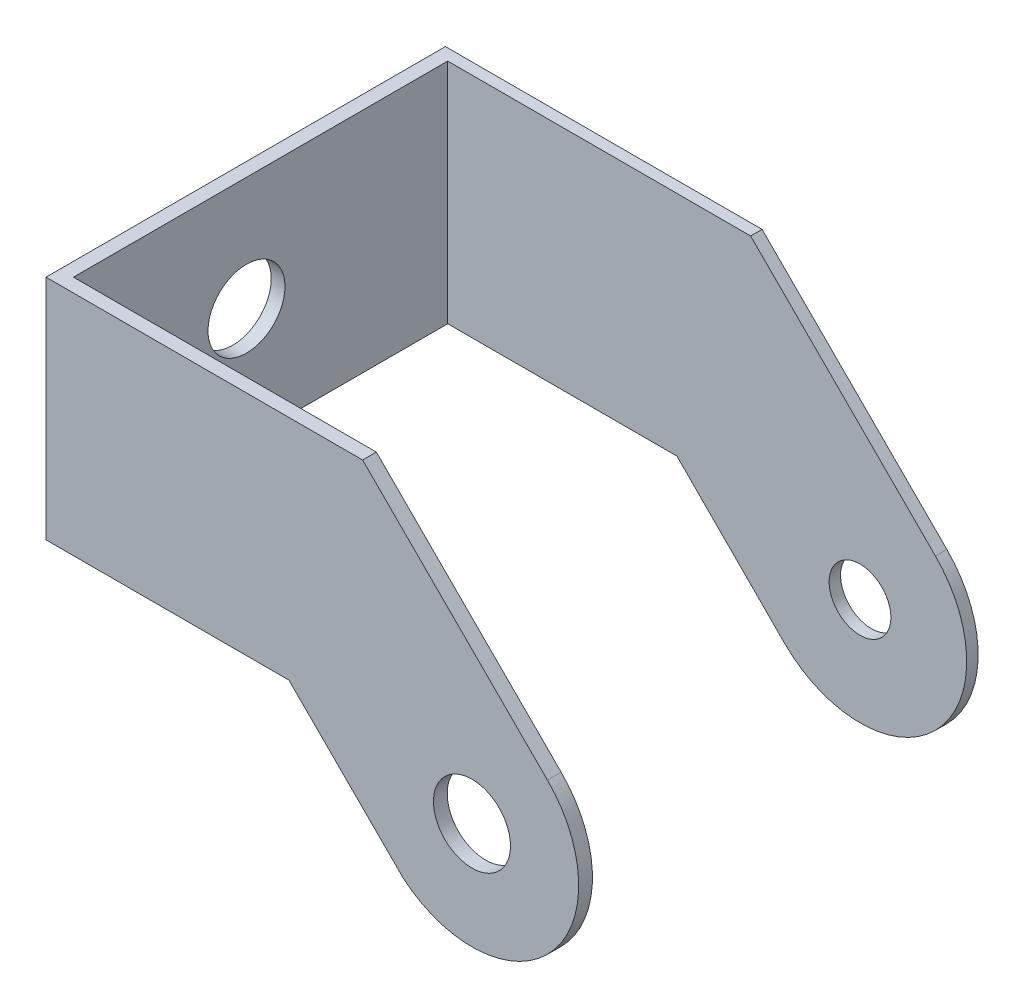
ISO-10303-21;
HEADER;
FILE_DESCRIPTION(('STEP AP214'),'2;1');
FILE_NAME('part.step','',(''),(''),'','','');
FILE_SCHEMA(('AUTOMOTIVE_DESIGN { 1 0 10303 214 1 1 1 1 }'));
ENDSEC;
DATA;
#1=APPLICATION_CONTEXT('core data for automotive mechanical design processes');
#2=APPLICATION_PROTOCOL_DEFINITION('international standard','automotive_design',2000,#1);
#3=PRODUCT_CONTEXT('',#1,'mechanical');
#4=PRODUCT('Part','Part','',(#3));
#5=PRODUCT_RELATED_PRODUCT_CATEGORY('part','',(#4));
#6=PRODUCT_DEFINITION_FORMATION('','',#4);
#7=PRODUCT_DEFINITION_CONTEXT('part definition',#1,'design');
#8=PRODUCT_DEFINITION('design','',#6,#7);
#9=PRODUCT_DEFINITION_SHAPE('','',#8);
#10=(LENGTH_UNIT() NAMED_UNIT(*) SI_UNIT(.MILLI.,.METRE.));
#11=(NAMED_UNIT(*) PLANE_ANGLE_UNIT() SI_UNIT($,.RADIAN.));
#12=(NAMED_UNIT(*) SI_UNIT($,.STERADIAN.) SOLID_ANGLE_UNIT());
#13=UNCERTAINTY_MEASURE_WITH_UNIT(LENGTH_MEASURE(1.E-05),#10,'distance_accuracy_value','');
#14=(GEOMETRIC_REPRESENTATION_CONTEXT(3) GLOBAL_UNCERTAINTY_ASSIGNED_CONTEXT((#13)) GLOBAL_UNIT_ASSIGNED_CONTEXT((#10,
#11,#12)) REPRESENTATION_CONTEXT('',''));
#15=CARTESIAN_POINT('',(0.,0.,0.));
#16=DIRECTION('',(0.,0.,1.));
#17=DIRECTION('',(1.,0.,0.));
#18=AXIS2_PLACEMENT_3D('',#15,#16,#17);
#19=CARTESIAN_POINT('',(0.,0.,0.));
#20=DIRECTION('',(0.,0.,1.));
#21=DIRECTION('',(1.,0.,0.));
#22=AXIS2_PLACEMENT_3D('',#19,#20,#21);
#23=PLANE('',#22);
#24=CARTESIAN_POINT('',(0.,0.,0.));
#25=DIRECTION('',(0.,0.,1.));
#26=DIRECTION('',(1.,0.,0.));
#27=AXIS2_PLACEMENT_3D('',#24,#25,#26);
#28=CIRCLE('',#27,5.05);
#29=CARTESIAN_POINT('',(5.05,0.,0.));
#30=VERTEX_POINT('',#29);
#31=EDGE_CURVE('E174',#30,#30,#28,.T.);
#32=ORIENTED_EDGE('',*,*,#31,.T.);
#33=EDGE_LOOP('',(#32));
#34=FACE_BOUND('',#33,.T.);
#35=DIRECTION('',(0.,-1.,0.));
#36=VECTOR('',#35,1.);
#37=CARTESIAN_POINT('',(-54.0823270036603,34.1445451971267,0.));
#38=LINE('',#37,#36);
#39=CARTESIAN_POINT('',(-54.0823270036603,34.1445451971267,0.));
#40=VERTEX_POINT('',#39);
#41=CARTESIAN_POINT('',(-54.0823270036603,4.30154748625039,0.));
#42=VERTEX_POINT('',#41);
#43=EDGE_CURVE('E52',#40,#42,#38,.T.);
#44=ORIENTED_EDGE('',*,*,#43,.F.);
#45=DIRECTION('',(-1.,0.,0.));
#46=VECTOR('',#45,1.);
#47=CARTESIAN_POINT('',(-55.8823270036603,34.1445451971267,0.));
#48=LINE('',#47,#46);
#49=CARTESIAN_POINT('',(-14.3455553239033,34.1445451971267,0.));
#50=VERTEX_POINT('',#49);
#51=EDGE_CURVE('E138',#50,#40,#48,.T.);
#52=ORIENTED_EDGE('',*,*,#51,.F.);
#53=DIRECTION('',(-0.707106781186547,0.707106781186548,0.));
#54=VECTOR('',#53,1.);
#55=CARTESIAN_POINT('',(9.89949493661166,9.89949493661166,0.));
#56=LINE('',#55,#54);
#57=CARTESIAN_POINT('',(9.89949493661166,9.89949493661166,0.));
#58=VERTEX_POINT('',#57);
#59=EDGE_CURVE('E135',#58,#50,#56,.T.);
#60=ORIENTED_EDGE('',*,*,#59,.F.);
#61=CARTESIAN_POINT('',(0.,0.,0.));
#62=DIRECTION('',(0.,0.,1.));
#63=DIRECTION('',(1.,0.,0.));
#64=AXIS2_PLACEMENT_3D('',#61,#62,#63);
#65=CIRCLE('',#64,14.);
#66=CARTESIAN_POINT('',(-8.97177070968306,-10.7474336626412,0.));
#67=VERTEX_POINT('',#66);
#68=EDGE_CURVE('E132',#67,#58,#65,.T.);
#69=ORIENTED_EDGE('',*,*,#68,.F.);
#70=DIRECTION('',(0.707106781186551,-0.707106781186544,0.));
#71=VECTOR('',#70,1.);
#72=CARTESIAN_POINT('',(-8.97177070968306,-10.7474336626412,0.));
#73=LINE('',#72,#71);
#74=CARTESIAN_POINT('',(-24.0207518585748,4.30154748625039,0.));
#75=VERTEX_POINT('',#74);
#76=EDGE_CURVE('E82',#75,#67,#73,.T.);
#77=ORIENTED_EDGE('',*,*,#76,.F.);
#78=DIRECTION('',(1.,0.,0.));
#79=VECTOR('',#78,1.);
#80=CARTESIAN_POINT('',(-24.0207518585748,4.30154748625039,0.));
#81=LINE('',#80,#79);
#82=EDGE_CURVE('E140',#42,#75,#81,.T.);
#83=ORIENTED_EDGE('',*,*,#82,.F.);
#84=EDGE_LOOP('',(#44,#52,#60,#69,#77,#83));
#85=FACE_BOUND('',#84,.T.);
#86=ADVANCED_FACE('F37',(#34,#85),#23,.F.);
#87=CARTESIAN_POINT('',(0.,0.,1.8));
#88=DIRECTION('',(0.,0.,1.));
#89=DIRECTION('',(1.,0.,0.));
#90=AXIS2_PLACEMENT_3D('',#87,#88,#89);
#91=PLANE('',#90);
#92=CARTESIAN_POINT('',(0.,0.,1.8));
#93=DIRECTION('',(0.,0.,1.));
#94=DIRECTION('',(1.,0.,0.));
#95=AXIS2_PLACEMENT_3D('',#92,#93,#94);
#96=CIRCLE('',#95,14.);
#97=CARTESIAN_POINT('',(-8.97177070968306,-10.7474336626412,1.8));
#98=VERTEX_POINT('',#97);
#99=CARTESIAN_POINT('',(9.89949493661166,9.89949493661166,1.8));
#100=VERTEX_POINT('',#99);
#101=EDGE_CURVE('E143',#98,#100,#96,.T.);
#102=ORIENTED_EDGE('',*,*,#101,.T.);
#103=DIRECTION('',(-0.707106781186547,0.707106781186548,0.));
#104=VECTOR('',#103,1.);
#105=CARTESIAN_POINT('',(9.89949493661166,9.89949493661166,1.8));
#106=LINE('',#105,#104);
#107=CARTESIAN_POINT('',(-14.3455553239033,34.1445451971267,1.8));
#108=VERTEX_POINT('',#107);
#109=EDGE_CURVE('E90',#100,#108,#106,.T.);
#110=ORIENTED_EDGE('',*,*,#109,.T.);
#111=DIRECTION('',(-1.,0.,0.));
#112=VECTOR('',#111,1.);
#113=CARTESIAN_POINT('',(-55.8823270036603,34.1445451971267,1.8));
#114=LINE('',#113,#112);
#115=CARTESIAN_POINT('',(-55.8823270036603,34.1445451971267,1.8));
#116=VERTEX_POINT('',#115);
#117=EDGE_CURVE('E107',#108,#116,#114,.T.);
#118=ORIENTED_EDGE('',*,*,#117,.T.);
#119=DIRECTION('',(0.,-1.,0.));
#120=VECTOR('',#119,1.);
#121=CARTESIAN_POINT('',(-55.8823270036603,4.30154748625039,1.8));
#122=LINE('',#121,#120);
#123=CARTESIAN_POINT('',(-55.8823270036603,4.30154748625039,1.8));
#124=VERTEX_POINT('',#123);
#125=EDGE_CURVE('E99',#116,#124,#122,.T.);
#126=ORIENTED_EDGE('',*,*,#125,.T.);
#127=DIRECTION('',(1.,0.,0.));
#128=VECTOR('',#127,1.);
#129=CARTESIAN_POINT('',(-24.0207518585748,4.30154748625039,1.8));
#130=LINE('',#129,#128);
#131=CARTESIAN_POINT('',(-24.0207518585748,4.30154748625039,1.8));
#132=VERTEX_POINT('',#131);
#133=EDGE_CURVE('E104',#124,#132,#130,.T.);
#134=ORIENTED_EDGE('',*,*,#133,.T.);
#135=DIRECTION('',(0.707106781186551,-0.707106781186544,0.));
#136=VECTOR('',#135,1.);
#137=CARTESIAN_POINT('',(-8.97177070968306,-10.7474336626412,1.8));
#138=LINE('',#137,#136);
#139=EDGE_CURVE('E61',#132,#98,#138,.T.);
#140=ORIENTED_EDGE('',*,*,#139,.T.);
#141=EDGE_LOOP('',(#102,#110,#118,#126,#134,#140));
#142=FACE_BOUND('',#141,.T.);
#143=CARTESIAN_POINT('',(0.,0.,1.8));
#144=DIRECTION('',(0.,0.,1.));
#145=DIRECTION('',(1.,0.,0.));
#146=AXIS2_PLACEMENT_3D('',#143,#144,#145);
#147=CIRCLE('',#146,5.05);
#148=CARTESIAN_POINT('',(5.05,0.,1.8));
#149=VERTEX_POINT('',#148);
#150=EDGE_CURVE('E136',#149,#149,#147,.T.);
#151=ORIENTED_EDGE('',*,*,#150,.F.);
#152=EDGE_LOOP('',(#151));
#153=FACE_BOUND('',#152,.T.);
#154=ADVANCED_FACE('F101',(#142,#153),#91,.T.);
#155=CARTESIAN_POINT('',(0.,0.,1.8));
#156=DIRECTION('',(0.,0.,-1.));
#157=DIRECTION('',(-1.,0.,0.));
#158=AXIS2_PLACEMENT_3D('',#155,#156,#157);
#159=CYLINDRICAL_SURFACE('',#158,14.);
#160=ORIENTED_EDGE('',*,*,#68,.T.);
#161=DIRECTION('',(0.,0.,-1.));
#162=VECTOR('',#161,1.);
#163=CARTESIAN_POINT('',(9.89949493661166,9.89949493661166,1.8));
#164=LINE('',#163,#162);
#165=EDGE_CURVE('E11',#100,#58,#164,.T.);
#166=ORIENTED_EDGE('',*,*,#165,.F.);
#167=ORIENTED_EDGE('',*,*,#101,.F.);
#168=DIRECTION('',(0.,0.,-1.));
#169=VECTOR('',#168,1.);
#170=CARTESIAN_POINT('',(-8.97177070968306,-10.7474336626412,1.8));
#171=LINE('',#170,#169);
#172=EDGE_CURVE('E128',#98,#67,#171,.T.);
#173=ORIENTED_EDGE('',*,*,#172,.T.);
#174=EDGE_LOOP('',(#160,#166,#167,#173));
#175=FACE_BOUND('',#174,.T.);
#176=ADVANCED_FACE('F39',(#175),#159,.T.);
#177=CARTESIAN_POINT('',(9.89949493661166,9.89949493661166,1.8));
#178=DIRECTION('',(-0.707106781186547,-0.707106781186547,0.));
#179=DIRECTION('',(0.707106781186547,-0.707106781186548,0.));
#180=AXIS2_PLACEMENT_3D('',#177,#178,#179);
#181=PLANE('',#180);
#182=ORIENTED_EDGE('',*,*,#59,.T.);
#183=DIRECTION('',(0.,0.,-1.));
#184=VECTOR('',#183,1.);
#185=CARTESIAN_POINT('',(-14.3455553239033,34.1445451971267,1.8));
#186=LINE('',#185,#184);
#187=EDGE_CURVE('E45',#108,#50,#186,.T.);
#188=ORIENTED_EDGE('',*,*,#187,.F.);
#189=ORIENTED_EDGE('',*,*,#109,.F.);
#190=ORIENTED_EDGE('',*,*,#165,.T.);
#191=EDGE_LOOP('',(#182,#188,#189,#190));
#192=FACE_BOUND('',#191,.T.);
#193=ADVANCED_FACE('F153',(#192),#181,.F.);
#194=CARTESIAN_POINT('',(-55.8823270036603,34.1445451971267,1.8));
#195=DIRECTION('',(0.,-1.,0.));
#196=DIRECTION('',(0.,0.,-1.));
#197=AXIS2_PLACEMENT_3D('',#194,#195,#196);
#198=PLANE('',#197);
#199=ORIENTED_EDGE('',*,*,#51,.T.);
#200=DIRECTION('',(0.,0.,1.));
#201=VECTOR('',#200,1.);
#202=CARTESIAN_POINT('',(-54.0823270036603,34.1445451971267,0.));
#203=LINE('',#202,#201);
#204=CARTESIAN_POINT('',(-54.0823270036603,34.1445451971267,-49.1));
#205=VERTEX_POINT('',#204);
#206=EDGE_CURVE('E166',#205,#40,#203,.T.);
#207=ORIENTED_EDGE('',*,*,#206,.F.);
#208=DIRECTION('',(1.,0.,0.));
#209=VECTOR('',#208,1.);
#210=CARTESIAN_POINT('',(-55.8823270036603,34.1445451971267,-49.1));
#211=LINE('',#210,#209);
#212=CARTESIAN_POINT('',(-14.3455553239033,34.1445451971267,-49.1));
#213=VERTEX_POINT('',#212);
#214=EDGE_CURVE('E388',#205,#213,#211,.T.);
#215=ORIENTED_EDGE('',*,*,#214,.T.);
#216=DIRECTION('',(0.,0.,1.));
#217=VECTOR('',#216,1.);
#218=CARTESIAN_POINT('',(-14.3455553239033,34.1445451971267,-50.6));
#219=LINE('',#218,#217);
#220=CARTESIAN_POINT('',(-14.3455553239033,34.1445451971267,-50.6));
#221=VERTEX_POINT('',#220);
#222=EDGE_CURVE('E395',#221,#213,#219,.T.);
#223=ORIENTED_EDGE('',*,*,#222,.F.);
#224=DIRECTION('',(1.,0.,0.));
#225=VECTOR('',#224,1.);
#226=CARTESIAN_POINT('',(-55.8823270036603,34.1445451971267,-50.6));
#227=LINE('',#226,#225);
#228=CARTESIAN_POINT('',(-55.8823270036603,34.1445451971267,-50.6));
#229=VERTEX_POINT('',#228);
#230=EDGE_CURVE('E375',#229,#221,#227,.T.);
#231=ORIENTED_EDGE('',*,*,#230,.F.);
#232=DIRECTION('',(0.,0.,-1.));
#233=VECTOR('',#232,1.);
#234=CARTESIAN_POINT('',(-55.8823270036603,34.1445451971267,1.8));
#235=LINE('',#234,#233);
#236=EDGE_CURVE('E123',#116,#229,#235,.T.);
#237=ORIENTED_EDGE('',*,*,#236,.F.);
#238=ORIENTED_EDGE('',*,*,#117,.F.);
#239=ORIENTED_EDGE('',*,*,#187,.T.);
#240=EDGE_LOOP('',(#199,#207,#215,#223,#231,#237,#238,#239));
#241=FACE_BOUND('',#240,.T.);
#242=ADVANCED_FACE('F148',(#241),#198,.F.);
#243=CARTESIAN_POINT('',(-55.8823270036603,4.30154748625039,1.8));
#244=DIRECTION('',(1.,0.,0.));
#245=DIRECTION('',(0.,0.,-1.));
#246=AXIS2_PLACEMENT_3D('',#243,#244,#245);
#247=PLANE('',#246);
#248=ORIENTED_EDGE('',*,*,#236,.T.);
#249=DIRECTION('',(0.,1.,0.));
#250=VECTOR('',#249,1.);
#251=CARTESIAN_POINT('',(-55.8823270036603,4.3015474862504,-50.6));
#252=LINE('',#251,#250);
#253=CARTESIAN_POINT('',(-55.8823270036603,4.3015474862504,-50.6));
#254=VERTEX_POINT('',#253);
#255=EDGE_CURVE('E119',#254,#229,#252,.T.);
#256=ORIENTED_EDGE('',*,*,#255,.F.);
#257=DIRECTION('',(0.,0.,-1.));
#258=VECTOR('',#257,1.);
#259=CARTESIAN_POINT('',(-55.8823270036603,4.30154748625039,1.8));
#260=LINE('',#259,#258);
#261=EDGE_CURVE('E114',#124,#254,#260,.T.);
#262=ORIENTED_EDGE('',*,*,#261,.F.);
#263=ORIENTED_EDGE('',*,*,#125,.F.);
#264=EDGE_LOOP('',(#248,#256,#262,#263));
#265=FACE_BOUND('',#264,.T.);
#266=CARTESIAN_POINT('',(-55.8823270036603,19.2134637320641,-22.7));
#267=DIRECTION('',(1.,0.,0.));
#268=DIRECTION('',(0.,0.,-1.));
#269=AXIS2_PLACEMENT_3D('',#266,#267,#268);
#270=CIRCLE('',#269,5.05);
#271=CARTESIAN_POINT('',(-55.8823270036603,19.2134637320641,-27.75));
#272=VERTEX_POINT('',#271);
#273=EDGE_CURVE('E403',#272,#272,#270,.T.);
#274=ORIENTED_EDGE('',*,*,#273,.T.);
#275=EDGE_LOOP('',(#274));
#276=FACE_BOUND('',#275,.T.);
#277=ADVANCED_FACE('F115',(#265,#276),#247,.F.);
#278=CARTESIAN_POINT('',(-24.0207518585748,4.30154748625039,1.8));
#279=DIRECTION('',(0.,1.,0.));
#280=DIRECTION('',(0.,0.,1.));
#281=AXIS2_PLACEMENT_3D('',#278,#279,#280);
#282=PLANE('',#281);
#283=ORIENTED_EDGE('',*,*,#261,.T.);
#284=DIRECTION('',(-1.,0.,0.));
#285=VECTOR('',#284,1.);
#286=CARTESIAN_POINT('',(-24.0207518585748,4.30154748625039,-50.6));
#287=LINE('',#286,#285);
#288=CARTESIAN_POINT('',(-24.0207518585748,4.30154748625039,-50.6));
#289=VERTEX_POINT('',#288);
#290=EDGE_CURVE('E372',#289,#254,#287,.T.);
#291=ORIENTED_EDGE('',*,*,#290,.F.);
#292=DIRECTION('',(0.,0.,1.));
#293=VECTOR('',#292,1.);
#294=CARTESIAN_POINT('',(-24.0207518585748,4.30154748625039,-50.6));
#295=LINE('',#294,#293);
#296=CARTESIAN_POINT('',(-24.0207518585748,4.30154748625039,-49.1));
#297=VERTEX_POINT('',#296);
#298=EDGE_CURVE('E398',#289,#297,#295,.T.);
#299=ORIENTED_EDGE('',*,*,#298,.T.);
#300=DIRECTION('',(-1.,0.,0.));
#301=VECTOR('',#300,1.);
#302=CARTESIAN_POINT('',(-24.0207518585748,4.30154748625039,-49.1));
#303=LINE('',#302,#301);
#304=CARTESIAN_POINT('',(-54.0823270036603,4.3015474862504,-49.1));
#305=VERTEX_POINT('',#304);
#306=EDGE_CURVE('E171',#297,#305,#303,.T.);
#307=ORIENTED_EDGE('',*,*,#306,.T.);
#308=DIRECTION('',(0.,0.,-1.));
#309=VECTOR('',#308,1.);
#310=CARTESIAN_POINT('',(-54.0823270036603,4.30154748625039,0.));
#311=LINE('',#310,#309);
#312=EDGE_CURVE('E165',#42,#305,#311,.T.);
#313=ORIENTED_EDGE('',*,*,#312,.F.);
#314=ORIENTED_EDGE('',*,*,#82,.T.);
#315=DIRECTION('',(0.,0.,-1.));
#316=VECTOR('',#315,1.);
#317=CARTESIAN_POINT('',(-24.0207518585748,4.30154748625039,1.8));
#318=LINE('',#317,#316);
#319=EDGE_CURVE('E124',#132,#75,#318,.T.);
#320=ORIENTED_EDGE('',*,*,#319,.F.);
#321=ORIENTED_EDGE('',*,*,#133,.F.);
#322=EDGE_LOOP('',(#283,#291,#299,#307,#313,#314,#320,#321));
#323=FACE_BOUND('',#322,.T.);
#324=ADVANCED_FACE('F126',(#323),#282,.F.);
#325=CARTESIAN_POINT('',(-8.97177070968306,-10.7474336626412,1.8));
#326=DIRECTION('',(0.707106781186544,0.707106781186551,0.));
#327=DIRECTION('',(-0.707106781186551,0.707106781186544,0.));
#328=AXIS2_PLACEMENT_3D('',#325,#326,#327);
#329=PLANE('',#328);
#330=ORIENTED_EDGE('',*,*,#76,.T.);
#331=ORIENTED_EDGE('',*,*,#172,.F.);
#332=ORIENTED_EDGE('',*,*,#139,.F.);
#333=ORIENTED_EDGE('',*,*,#319,.T.);
#334=EDGE_LOOP('',(#330,#331,#332,#333));
#335=FACE_BOUND('',#334,.T.);
#336=ADVANCED_FACE('F156',(#335),#329,.F.);
#337=CARTESIAN_POINT('',(0.,0.,1.8));
#338=DIRECTION('',(0.,0.,-1.));
#339=DIRECTION('',(-1.,0.,0.));
#340=AXIS2_PLACEMENT_3D('',#337,#338,#339);
#341=CYLINDRICAL_SURFACE('',#340,5.05);
#342=ORIENTED_EDGE('',*,*,#150,.T.);
#343=EDGE_LOOP('',(#342));
#344=FACE_BOUND('',#343,.T.);
#345=ORIENTED_EDGE('',*,*,#31,.F.);
#346=EDGE_LOOP('',(#345));
#347=FACE_BOUND('',#346,.T.);
#348=ADVANCED_FACE('F186',(#344,#347),#341,.F.);
#349=CARTESIAN_POINT('',(-54.0823270036603,0.,0.));
#350=DIRECTION('',(-1.,0.,0.));
#351=DIRECTION('',(0.,0.,1.));
#352=AXIS2_PLACEMENT_3D('',#349,#350,#351);
#353=PLANE('',#352);
#354=ORIENTED_EDGE('',*,*,#206,.T.);
#355=ORIENTED_EDGE('',*,*,#43,.T.);
#356=ORIENTED_EDGE('',*,*,#312,.T.);
#357=DIRECTION('',(0.,1.,0.));
#358=VECTOR('',#357,1.);
#359=CARTESIAN_POINT('',(-54.0823270036603,34.1445451971267,-49.1));
#360=LINE('',#359,#358);
#361=EDGE_CURVE('E172',#305,#205,#360,.T.);
#362=ORIENTED_EDGE('',*,*,#361,.T.);
#363=EDGE_LOOP('',(#354,#355,#356,#362));
#364=FACE_BOUND('',#363,.T.);
#365=CARTESIAN_POINT('',(-54.0823270036603,19.2134637320641,-22.7));
#366=DIRECTION('',(1.,0.,0.));
#367=DIRECTION('',(0.,0.,-1.));
#368=AXIS2_PLACEMENT_3D('',#365,#366,#367);
#369=CIRCLE('',#368,5.05);
#370=CARTESIAN_POINT('',(-54.0823270036603,19.2134637320641,-27.75));
#371=VERTEX_POINT('',#370);
#372=EDGE_CURVE('E404',#371,#371,#369,.T.);
#373=ORIENTED_EDGE('',*,*,#372,.F.);
#374=EDGE_LOOP('',(#373));
#375=FACE_BOUND('',#374,.T.);
#376=ADVANCED_FACE('F162',(#364,#375),#353,.F.);
#377=CARTESIAN_POINT('',(-54.0823270036603,19.2134637320641,-22.7));
#378=DIRECTION('',(-1.,0.,0.));
#379=DIRECTION('',(0.,0.,1.));
#380=AXIS2_PLACEMENT_3D('',#377,#378,#379);
#381=CYLINDRICAL_SURFACE('',#380,5.05);
#382=ORIENTED_EDGE('',*,*,#372,.T.);
#383=EDGE_LOOP('',(#382));
#384=FACE_BOUND('',#383,.T.);
#385=ORIENTED_EDGE('',*,*,#273,.F.);
#386=EDGE_LOOP('',(#385));
#387=FACE_BOUND('',#386,.T.);
#388=ADVANCED_FACE('F194',(#384,#387),#381,.F.);
#389=CARTESIAN_POINT('',(0.,0.,-50.6));
#390=DIRECTION('',(0.,0.,-1.));
#391=DIRECTION('',(-1.,0.,0.));
#392=AXIS2_PLACEMENT_3D('',#389,#390,#391);
#393=PLANE('',#392);
#394=CARTESIAN_POINT('',(0.,0.,-50.6));
#395=DIRECTION('',(0.,0.,-1.));
#396=DIRECTION('',(-1.,0.,0.));
#397=AXIS2_PLACEMENT_3D('',#394,#395,#396);
#398=CIRCLE('',#397,14.);
#399=CARTESIAN_POINT('',(9.89949493661166,9.89949493661166,-50.6));
#400=VERTEX_POINT('',#399);
#401=CARTESIAN_POINT('',(-9.89949493661166,-9.89949493661166,-50.6));
#402=VERTEX_POINT('',#401);
#403=EDGE_CURVE('E365',#400,#402,#398,.T.);
#404=ORIENTED_EDGE('',*,*,#403,.T.);
#405=DIRECTION('',(-0.70511202403612,0.70909592690953,0.));
#406=VECTOR('',#405,1.);
#407=CARTESIAN_POINT('',(-9.89949493661166,-9.89949493661166,-50.6));
#408=LINE('',#407,#406);
#409=EDGE_CURVE('E368',#402,#289,#408,.T.);
#410=ORIENTED_EDGE('',*,*,#409,.T.);
#411=ORIENTED_EDGE('',*,*,#290,.T.);
#412=ORIENTED_EDGE('',*,*,#255,.T.);
#413=ORIENTED_EDGE('',*,*,#230,.T.);
#414=DIRECTION('',(0.707106781186547,-0.707106781186548,0.));
#415=VECTOR('',#414,1.);
#416=CARTESIAN_POINT('',(9.89949493661166,9.89949493661166,-50.6));
#417=LINE('',#416,#415);
#418=EDGE_CURVE('E378',#221,#400,#417,.T.);
#419=ORIENTED_EDGE('',*,*,#418,.T.);
#420=EDGE_LOOP('',(#404,#410,#411,#412,#413,#419));
#421=FACE_BOUND('',#420,.T.);
#422=CARTESIAN_POINT('',(0.,0.,-50.6));
#423=DIRECTION('',(0.,0.,-1.));
#424=DIRECTION('',(-1.,0.,0.));
#425=AXIS2_PLACEMENT_3D('',#422,#423,#424);
#426=CIRCLE('',#425,4.05);
#427=CARTESIAN_POINT('',(-4.05,0.,-50.6));
#428=VERTEX_POINT('',#427);
#429=EDGE_CURVE('E356',#428,#428,#426,.T.);
#430=ORIENTED_EDGE('',*,*,#429,.F.);
#431=EDGE_LOOP('',(#430));
#432=FACE_BOUND('',#431,.T.);
#433=ADVANCED_FACE('F269',(#421,#432),#393,.T.);
#434=CARTESIAN_POINT('',(0.,0.,-49.1));
#435=DIRECTION('',(0.,0.,-1.));
#436=DIRECTION('',(-1.,0.,0.));
#437=AXIS2_PLACEMENT_3D('',#434,#435,#436);
#438=PLANE('',#437);
#439=ORIENTED_EDGE('',*,*,#361,.F.);
#440=ORIENTED_EDGE('',*,*,#306,.F.);
#441=DIRECTION('',(-0.70511202403612,0.70909592690953,0.));
#442=VECTOR('',#441,1.);
#443=CARTESIAN_POINT('',(-9.89949493661166,-9.89949493661166,-49.1));
#444=LINE('',#443,#442);
#445=CARTESIAN_POINT('',(-9.89949493661166,-9.89949493661166,-49.1));
#446=VERTEX_POINT('',#445);
#447=EDGE_CURVE('E384',#446,#297,#444,.T.);
#448=ORIENTED_EDGE('',*,*,#447,.F.);
#449=CARTESIAN_POINT('',(0.,0.,-49.1));
#450=DIRECTION('',(0.,0.,-1.));
#451=DIRECTION('',(-1.,0.,0.));
#452=AXIS2_PLACEMENT_3D('',#449,#450,#451);
#453=CIRCLE('',#452,14.);
#454=CARTESIAN_POINT('',(9.89949493661166,9.89949493661166,-49.1));
#455=VERTEX_POINT('',#454);
#456=EDGE_CURVE('E362',#455,#446,#453,.T.);
#457=ORIENTED_EDGE('',*,*,#456,.F.);
#458=DIRECTION('',(0.707106781186547,-0.707106781186548,0.));
#459=VECTOR('',#458,1.);
#460=CARTESIAN_POINT('',(9.89949493661166,9.89949493661166,-49.1));
#461=LINE('',#460,#459);
#462=EDGE_CURVE('E369',#213,#455,#461,.T.);
#463=ORIENTED_EDGE('',*,*,#462,.F.);
#464=ORIENTED_EDGE('',*,*,#214,.F.);
#465=EDGE_LOOP('',(#439,#440,#448,#457,#463,#464));
#466=FACE_BOUND('',#465,.T.);
#467=CARTESIAN_POINT('',(0.,0.,-49.1));
#468=DIRECTION('',(0.,0.,-1.));
#469=DIRECTION('',(-1.,0.,0.));
#470=AXIS2_PLACEMENT_3D('',#467,#468,#469);
#471=CIRCLE('',#470,4.05);
#472=CARTESIAN_POINT('',(-4.05,0.,-49.1));
#473=VERTEX_POINT('',#472);
#474=EDGE_CURVE('E359',#473,#473,#471,.T.);
#475=ORIENTED_EDGE('',*,*,#474,.T.);
#476=EDGE_LOOP('',(#475));
#477=FACE_BOUND('',#476,.T.);
#478=ADVANCED_FACE('F299',(#466,#477),#438,.F.);
#479=CARTESIAN_POINT('',(0.,0.,-50.6));
#480=DIRECTION('',(0.,0.,1.));
#481=DIRECTION('',(1.,0.,0.));
#482=AXIS2_PLACEMENT_3D('',#479,#480,#481);
#483=CYLINDRICAL_SURFACE('',#482,14.);
#484=ORIENTED_EDGE('',*,*,#456,.T.);
#485=DIRECTION('',(0.,0.,1.));
#486=VECTOR('',#485,1.);
#487=CARTESIAN_POINT('',(-9.89949493661166,-9.89949493661166,-50.6));
#488=LINE('',#487,#486);
#489=EDGE_CURVE('E400',#402,#446,#488,.T.);
#490=ORIENTED_EDGE('',*,*,#489,.F.);
#491=ORIENTED_EDGE('',*,*,#403,.F.);
#492=DIRECTION('',(0.,0.,1.));
#493=VECTOR('',#492,1.);
#494=CARTESIAN_POINT('',(9.89949493661166,9.89949493661166,-50.6));
#495=LINE('',#494,#493);
#496=EDGE_CURVE('E381',#400,#455,#495,.T.);
#497=ORIENTED_EDGE('',*,*,#496,.T.);
#498=EDGE_LOOP('',(#484,#490,#491,#497));
#499=FACE_BOUND('',#498,.T.);
#500=ADVANCED_FACE('F309',(#499),#483,.T.);
#501=CARTESIAN_POINT('',(-9.89949493661166,-9.89949493661166,-50.6));
#502=DIRECTION('',(0.70909592690953,0.70511202403612,0.));
#503=DIRECTION('',(-0.70511202403612,0.70909592690953,0.));
#504=AXIS2_PLACEMENT_3D('',#501,#502,#503);
#505=PLANE('',#504);
#506=ORIENTED_EDGE('',*,*,#447,.T.);
#507=ORIENTED_EDGE('',*,*,#298,.F.);
#508=ORIENTED_EDGE('',*,*,#409,.F.);
#509=ORIENTED_EDGE('',*,*,#489,.T.);
#510=EDGE_LOOP('',(#506,#507,#508,#509));
#511=FACE_BOUND('',#510,.T.);
#512=ADVANCED_FACE('F319',(#511),#505,.F.);
#513=CARTESIAN_POINT('',(9.89949493661166,9.89949493661166,-50.6));
#514=DIRECTION('',(-0.707106781186548,-0.707106781186547,0.));
#515=DIRECTION('',(0.707106781186547,-0.707106781186548,0.));
#516=AXIS2_PLACEMENT_3D('',#513,#514,#515);
#517=PLANE('',#516);
#518=ORIENTED_EDGE('',*,*,#462,.T.);
#519=ORIENTED_EDGE('',*,*,#496,.F.);
#520=ORIENTED_EDGE('',*,*,#418,.F.);
#521=ORIENTED_EDGE('',*,*,#222,.T.);
#522=EDGE_LOOP('',(#518,#519,#520,#521));
#523=FACE_BOUND('',#522,.T.);
#524=ADVANCED_FACE('F329',(#523),#517,.F.);
#525=CARTESIAN_POINT('',(0.,0.,-50.6));
#526=DIRECTION('',(0.,0.,1.));
#527=DIRECTION('',(1.,0.,0.));
#528=AXIS2_PLACEMENT_3D('',#525,#526,#527);
#529=CYLINDRICAL_SURFACE('',#528,4.05);
#530=ORIENTED_EDGE('',*,*,#429,.T.);
#531=EDGE_LOOP('',(#530));
#532=FACE_BOUND('',#531,.T.);
#533=ORIENTED_EDGE('',*,*,#474,.F.);
#534=EDGE_LOOP('',(#533));
#535=FACE_BOUND('',#534,.T.);
#536=ADVANCED_FACE('F339',(#532,#535),#529,.F.);
#537=CLOSED_SHELL('',(#86,#154,#176,#193,#242,#277,#324,#336,#348,#376,#388,#433,#478,#500,#512,
#524,#536));
#538=MANIFOLD_SOLID_BREP('B2',#537);
#539=ADVANCED_BREP_SHAPE_REPRESENTATION('',(#18,#538),#14);
#540=SHAPE_DEFINITION_REPRESENTATION(#9,#539);
ENDSEC;
END-ISO-10303-21;
